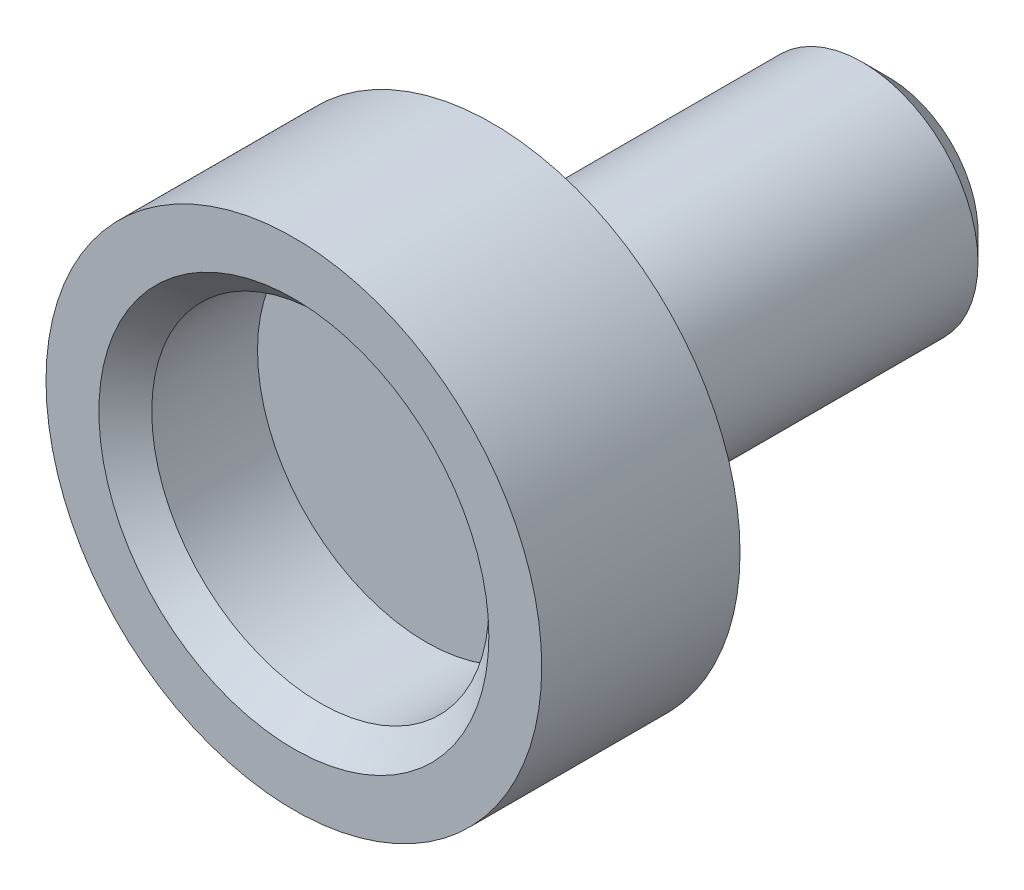
ISO-10303-21;
HEADER;
FILE_DESCRIPTION(('STEP AP214'),'2;1');
FILE_NAME('part.step','',(''),(''),'','','');
FILE_SCHEMA(('AUTOMOTIVE_DESIGN { 1 0 10303 214 1 1 1 1 }'));
ENDSEC;
DATA;
#1=APPLICATION_CONTEXT('core data for automotive mechanical design processes');
#2=APPLICATION_PROTOCOL_DEFINITION('international standard','automotive_design',2000,#1);
#3=PRODUCT_CONTEXT('',#1,'mechanical');
#4=PRODUCT('Part','Part','',(#3));
#5=PRODUCT_RELATED_PRODUCT_CATEGORY('part','',(#4));
#6=PRODUCT_DEFINITION_FORMATION('','',#4);
#7=PRODUCT_DEFINITION_CONTEXT('part definition',#1,'design');
#8=PRODUCT_DEFINITION('design','',#6,#7);
#9=PRODUCT_DEFINITION_SHAPE('','',#8);
#10=(LENGTH_UNIT() NAMED_UNIT(*) SI_UNIT(.MILLI.,.METRE.));
#11=(NAMED_UNIT(*) PLANE_ANGLE_UNIT() SI_UNIT($,.RADIAN.));
#12=(NAMED_UNIT(*) SI_UNIT($,.STERADIAN.) SOLID_ANGLE_UNIT());
#13=UNCERTAINTY_MEASURE_WITH_UNIT(LENGTH_MEASURE(1.E-05),#10,'distance_accuracy_value','');
#14=(GEOMETRIC_REPRESENTATION_CONTEXT(3) GLOBAL_UNCERTAINTY_ASSIGNED_CONTEXT((#13)) GLOBAL_UNIT_ASSIGNED_CONTEXT((#10,
#11,#12)) REPRESENTATION_CONTEXT('',''));
#15=CARTESIAN_POINT('',(0.,0.,0.));
#16=DIRECTION('',(0.,0.,1.));
#17=DIRECTION('',(1.,0.,0.));
#18=AXIS2_PLACEMENT_3D('',#15,#16,#17);
#19=CARTESIAN_POINT('',(0.,0.,2.));
#20=DIRECTION('',(0.,0.,1.));
#21=DIRECTION('',(1.,0.,0.));
#22=AXIS2_PLACEMENT_3D('',#19,#20,#21);
#23=PLANE('',#22);
#24=CARTESIAN_POINT('',(0.,0.,2.));
#25=DIRECTION('',(0.,0.,1.));
#26=DIRECTION('',(1.,0.,0.));
#27=AXIS2_PLACEMENT_3D('',#24,#25,#26);
#28=CIRCLE('',#27,2.95);
#29=CARTESIAN_POINT('',(2.95,0.,2.));
#30=VERTEX_POINT('',#29);
#31=EDGE_CURVE('E10',#30,#30,#28,.F.);
#32=ORIENTED_EDGE('',*,*,#31,.T.);
#33=EDGE_LOOP('',(#32));
#34=FACE_BOUND('',#33,.T.);
#35=CARTESIAN_POINT('',(0.,0.,2.));
#36=DIRECTION('',(0.,0.,1.));
#37=DIRECTION('',(1.,0.,0.));
#38=AXIS2_PLACEMENT_3D('',#35,#36,#37);
#39=CIRCLE('',#38,3.75);
#40=CARTESIAN_POINT('',(3.75,0.,2.));
#41=VERTEX_POINT('',#40);
#42=EDGE_CURVE('E57',#41,#41,#39,.T.);
#43=ORIENTED_EDGE('',*,*,#42,.T.);
#44=EDGE_LOOP('',(#43));
#45=FACE_BOUND('',#44,.T.);
#46=ADVANCED_FACE('F31',(#34,#45),#23,.T.);
#47=CARTESIAN_POINT('',(0.,0.,2.));
#48=DIRECTION('',(0.,0.,-1.));
#49=DIRECTION('',(-1.,0.,0.));
#50=AXIS2_PLACEMENT_3D('',#47,#48,#49);
#51=CYLINDRICAL_SURFACE('',#50,3.75);
#52=ORIENTED_EDGE('',*,*,#42,.F.);
#53=EDGE_LOOP('',(#52));
#54=FACE_BOUND('',#53,.T.);
#55=CARTESIAN_POINT('',(0.,0.,-1.));
#56=DIRECTION('',(0.,0.,-1.));
#57=DIRECTION('',(-1.,0.,0.));
#58=AXIS2_PLACEMENT_3D('',#55,#56,#57);
#59=CIRCLE('',#58,3.75);
#60=CARTESIAN_POINT('',(-3.75,0.,-1.));
#61=VERTEX_POINT('',#60);
#62=EDGE_CURVE('E63',#61,#61,#59,.T.);
#63=ORIENTED_EDGE('',*,*,#62,.F.);
#64=EDGE_LOOP('',(#63));
#65=FACE_BOUND('',#64,.T.);
#66=ADVANCED_FACE('F69',(#54,#65),#51,.T.);
#67=CARTESIAN_POINT('',(0.,0.,2.));
#68=DIRECTION('',(0.,0.,-1.));
#69=DIRECTION('',(-1.,0.,0.));
#70=AXIS2_PLACEMENT_3D('',#67,#68,#69);
#71=CYLINDRICAL_SURFACE('',#70,2.55);
#72=CARTESIAN_POINT('',(0.,0.,1.6));
#73=DIRECTION('',(0.,0.,1.));
#74=DIRECTION('',(1.,0.,0.));
#75=AXIS2_PLACEMENT_3D('',#72,#73,#74);
#76=CIRCLE('',#75,2.55);
#77=CARTESIAN_POINT('',(2.55,0.,1.6));
#78=VERTEX_POINT('',#77);
#79=EDGE_CURVE('E38',#78,#78,#76,.T.);
#80=ORIENTED_EDGE('',*,*,#79,.T.);
#81=EDGE_LOOP('',(#80));
#82=FACE_BOUND('',#81,.T.);
#83=CARTESIAN_POINT('',(0.,0.,0.));
#84=DIRECTION('',(0.,0.,1.));
#85=DIRECTION('',(1.,0.,0.));
#86=AXIS2_PLACEMENT_3D('',#83,#84,#85);
#87=CIRCLE('',#86,2.55);
#88=CARTESIAN_POINT('',(2.55,0.,0.));
#89=VERTEX_POINT('',#88);
#90=EDGE_CURVE('E60',#89,#89,#87,.T.);
#91=ORIENTED_EDGE('',*,*,#90,.F.);
#92=EDGE_LOOP('',(#91));
#93=FACE_BOUND('',#92,.T.);
#94=ADVANCED_FACE('F71',(#82,#93),#71,.F.);
#95=CARTESIAN_POINT('',(0.,0.,0.));
#96=DIRECTION('',(0.,0.,-1.));
#97=DIRECTION('',(-1.,0.,0.));
#98=AXIS2_PLACEMENT_3D('',#95,#96,#97);
#99=PLANE('',#98);
#100=ORIENTED_EDGE('',*,*,#90,.T.);
#101=EDGE_LOOP('',(#100));
#102=FACE_BOUND('',#101,.T.);
#103=ADVANCED_FACE('F78',(#102),#99,.F.);
#104=CARTESIAN_POINT('',(0.,0.,-1.));
#105=DIRECTION('',(0.,0.,-1.));
#106=DIRECTION('',(-1.,0.,0.));
#107=AXIS2_PLACEMENT_3D('',#104,#105,#106);
#108=PLANE('',#107);
#109=CARTESIAN_POINT('',(0.,0.,-1.));
#110=DIRECTION('',(0.,0.,-1.));
#111=DIRECTION('',(-1.,0.,0.));
#112=AXIS2_PLACEMENT_3D('',#109,#110,#111);
#113=CIRCLE('',#112,2.35);
#114=CARTESIAN_POINT('',(-2.35,0.,-1.));
#115=VERTEX_POINT('',#114);
#116=EDGE_CURVE('E51',#115,#115,#113,.F.);
#117=ORIENTED_EDGE('',*,*,#116,.T.);
#118=EDGE_LOOP('',(#117));
#119=FACE_BOUND('',#118,.T.);
#120=ORIENTED_EDGE('',*,*,#62,.T.);
#121=EDGE_LOOP('',(#120));
#122=FACE_BOUND('',#121,.T.);
#123=ADVANCED_FACE('F67',(#119,#122),#108,.T.);
#124=CARTESIAN_POINT('',(0.,0.,-7.));
#125=DIRECTION('',(0.,0.,1.));
#126=DIRECTION('',(1.,0.,0.));
#127=AXIS2_PLACEMENT_3D('',#124,#125,#126);
#128=CYLINDRICAL_SURFACE('',#127,1.75);
#129=CARTESIAN_POINT('',(0.,0.,-6.6));
#130=DIRECTION('',(0.,0.,-1.));
#131=DIRECTION('',(-1.,0.,0.));
#132=AXIS2_PLACEMENT_3D('',#129,#130,#131);
#133=CIRCLE('',#132,1.75);
#134=CARTESIAN_POINT('',(-1.75,0.,-6.6));
#135=VERTEX_POINT('',#134);
#136=EDGE_CURVE('E42',#135,#135,#133,.F.);
#137=ORIENTED_EDGE('',*,*,#136,.T.);
#138=EDGE_LOOP('',(#137));
#139=FACE_BOUND('',#138,.T.);
#140=CARTESIAN_POINT('',(0.,0.,-1.6));
#141=DIRECTION('',(0.,0.,-1.));
#142=DIRECTION('',(-1.,0.,0.));
#143=AXIS2_PLACEMENT_3D('',#140,#141,#142);
#144=CIRCLE('',#143,1.75);
#145=CARTESIAN_POINT('',(-1.75,0.,-1.6));
#146=VERTEX_POINT('',#145);
#147=EDGE_CURVE('E54',#146,#146,#144,.T.);
#148=ORIENTED_EDGE('',*,*,#147,.T.);
#149=EDGE_LOOP('',(#148));
#150=FACE_BOUND('',#149,.T.);
#151=ADVANCED_FACE('F99',(#139,#150),#128,.T.);
#152=CARTESIAN_POINT('',(0.,0.,-7.));
#153=DIRECTION('',(0.,0.,-1.));
#154=DIRECTION('',(-1.,0.,0.));
#155=AXIS2_PLACEMENT_3D('',#152,#153,#154);
#156=PLANE('',#155);
#157=CARTESIAN_POINT('',(0.,0.,-7.));
#158=DIRECTION('',(0.,0.,-1.));
#159=DIRECTION('',(-1.,0.,0.));
#160=AXIS2_PLACEMENT_3D('',#157,#158,#159);
#161=CIRCLE('',#160,1.35);
#162=CARTESIAN_POINT('',(-1.35,0.,-7.));
#163=VERTEX_POINT('',#162);
#164=EDGE_CURVE('E46',#163,#163,#161,.T.);
#165=ORIENTED_EDGE('',*,*,#164,.T.);
#166=EDGE_LOOP('',(#165));
#167=FACE_BOUND('',#166,.T.);
#168=ADVANCED_FACE('F86',(#167),#156,.T.);
#169=CARTESIAN_POINT('',(0.,0.,-1.6));
#170=DIRECTION('',(0.,0.,-1.));
#171=DIRECTION('',(-1.,0.,0.));
#172=AXIS2_PLACEMENT_3D('',#169,#170,#171);
#173=TOROIDAL_SURFACE('',#172,2.35,0.6);
#174=ORIENTED_EDGE('',*,*,#116,.F.);
#175=EDGE_LOOP('',(#174));
#176=FACE_BOUND('',#175,.T.);
#177=ORIENTED_EDGE('',*,*,#147,.F.);
#178=EDGE_LOOP('',(#177));
#179=FACE_BOUND('',#178,.T.);
#180=ADVANCED_FACE('F83',(#176,#179),#173,.F.);
#181=CARTESIAN_POINT('',(0.,0.,-7.));
#182=DIRECTION('',(0.,0.,1.));
#183=DIRECTION('',(1.,0.,0.));
#184=AXIS2_PLACEMENT_3D('',#181,#182,#183);
#185=CONICAL_SURFACE('',#184,1.35,0.785398163397446);
#186=ORIENTED_EDGE('',*,*,#136,.F.);
#187=EDGE_LOOP('',(#186));
#188=FACE_BOUND('',#187,.T.);
#189=ORIENTED_EDGE('',*,*,#164,.F.);
#190=EDGE_LOOP('',(#189));
#191=FACE_BOUND('',#190,.T.);
#192=ADVANCED_FACE('F85',(#188,#191),#185,.T.);
#193=CARTESIAN_POINT('',(0.,0.,1.6));
#194=DIRECTION('',(0.,0.,1.));
#195=DIRECTION('',(1.,0.,0.));
#196=AXIS2_PLACEMENT_3D('',#193,#194,#195);
#197=CONICAL_SURFACE('',#196,2.55,0.785398163397449);
#198=ORIENTED_EDGE('',*,*,#31,.F.);
#199=EDGE_LOOP('',(#198));
#200=FACE_BOUND('',#199,.T.);
#201=ORIENTED_EDGE('',*,*,#79,.F.);
#202=EDGE_LOOP('',(#201));
#203=FACE_BOUND('',#202,.T.);
#204=ADVANCED_FACE('F33',(#200,#203),#197,.F.);
#205=CLOSED_SHELL('',(#46,#66,#94,#103,#123,#151,#168,#180,#192,#204));
#206=MANIFOLD_SOLID_BREP('B2',#205);
#207=ADVANCED_BREP_SHAPE_REPRESENTATION('',(#18,#206),#14);
#208=SHAPE_DEFINITION_REPRESENTATION(#9,#207);
ENDSEC;
END-ISO-10303-21;
